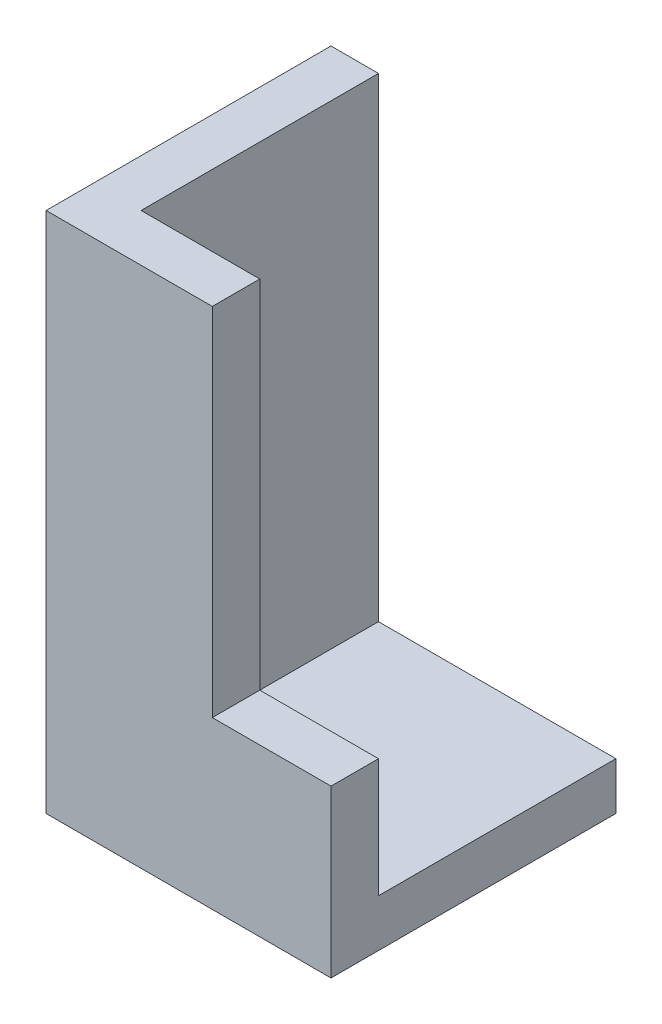
ISO-10303-21;
HEADER;
FILE_DESCRIPTION(('STEP AP214'),'2;1');
FILE_NAME('part.step','',(''),(''),'','','');
FILE_SCHEMA(('AUTOMOTIVE_DESIGN { 1 0 10303 214 1 1 1 1 }'));
ENDSEC;
DATA;
#1=APPLICATION_CONTEXT('core data for automotive mechanical design processes');
#2=APPLICATION_PROTOCOL_DEFINITION('international standard','automotive_design',2000,#1);
#3=PRODUCT_CONTEXT('',#1,'mechanical');
#4=PRODUCT('Part','Part','',(#3));
#5=PRODUCT_RELATED_PRODUCT_CATEGORY('part','',(#4));
#6=PRODUCT_DEFINITION_FORMATION('','',#4);
#7=PRODUCT_DEFINITION_CONTEXT('part definition',#1,'design');
#8=PRODUCT_DEFINITION('design','',#6,#7);
#9=PRODUCT_DEFINITION_SHAPE('','',#8);
#10=(LENGTH_UNIT() NAMED_UNIT(*) SI_UNIT(.MILLI.,.METRE.));
#11=(NAMED_UNIT(*) PLANE_ANGLE_UNIT() SI_UNIT($,.RADIAN.));
#12=(NAMED_UNIT(*) SI_UNIT($,.STERADIAN.) SOLID_ANGLE_UNIT());
#13=UNCERTAINTY_MEASURE_WITH_UNIT(LENGTH_MEASURE(1.E-05),#10,'distance_accuracy_value','');
#14=(GEOMETRIC_REPRESENTATION_CONTEXT(3) GLOBAL_UNCERTAINTY_ASSIGNED_CONTEXT((#13)) GLOBAL_UNIT_ASSIGNED_CONTEXT((#10,
#11,#12)) REPRESENTATION_CONTEXT('',''));
#15=CARTESIAN_POINT('',(0.,0.,0.));
#16=DIRECTION('',(0.,0.,1.));
#17=DIRECTION('',(1.,0.,0.));
#18=AXIS2_PLACEMENT_3D('',#15,#16,#17);
#19=CARTESIAN_POINT('',(0.,0.,50.));
#20=DIRECTION('',(1.,0.,0.));
#21=DIRECTION('',(0.,0.,-1.));
#22=AXIS2_PLACEMENT_3D('',#19,#20,#21);
#23=PLANE('',#22);
#24=DIRECTION('',(0.,-1.,0.));
#25=VECTOR('',#24,1.);
#26=CARTESIAN_POINT('',(0.,0.,0.));
#27=LINE('',#26,#25);
#28=CARTESIAN_POINT('',(0.,110.,0.));
#29=VERTEX_POINT('',#28);
#30=CARTESIAN_POINT('',(0.,0.,0.));
#31=VERTEX_POINT('',#30);
#32=EDGE_CURVE('E96',#29,#31,#27,.T.);
#33=ORIENTED_EDGE('',*,*,#32,.T.);
#34=DIRECTION('',(0.,0.,-1.));
#35=VECTOR('',#34,1.);
#36=CARTESIAN_POINT('',(0.,0.,50.));
#37=LINE('',#36,#35);
#38=CARTESIAN_POINT('',(0.,0.,60.));
#39=VERTEX_POINT('',#38);
#40=EDGE_CURVE('E11',#39,#31,#37,.T.);
#41=ORIENTED_EDGE('',*,*,#40,.F.);
#42=DIRECTION('',(0.,-1.,0.));
#43=VECTOR('',#42,1.);
#44=CARTESIAN_POINT('',(0.,0.,60.));
#45=LINE('',#44,#43);
#46=CARTESIAN_POINT('',(0.,110.,60.));
#47=VERTEX_POINT('',#46);
#48=EDGE_CURVE('E98',#47,#39,#45,.T.);
#49=ORIENTED_EDGE('',*,*,#48,.F.);
#50=DIRECTION('',(0.,0.,-1.));
#51=VECTOR('',#50,1.);
#52=CARTESIAN_POINT('',(0.,110.,50.));
#53=LINE('',#52,#51);
#54=EDGE_CURVE('E84',#47,#29,#53,.T.);
#55=ORIENTED_EDGE('',*,*,#54,.T.);
#56=EDGE_LOOP('',(#33,#41,#49,#55));
#57=FACE_BOUND('',#56,.T.);
#58=ADVANCED_FACE('F33',(#57),#23,.F.);
#59=CARTESIAN_POINT('',(0.,0.,50.));
#60=DIRECTION('',(0.,1.,0.));
#61=DIRECTION('',(0.,0.,1.));
#62=AXIS2_PLACEMENT_3D('',#59,#60,#61);
#63=PLANE('',#62);
#64=DIRECTION('',(1.,0.,0.));
#65=VECTOR('',#64,1.);
#66=CARTESIAN_POINT('',(0.,0.,0.));
#67=LINE('',#66,#65);
#68=CARTESIAN_POINT('',(60.,0.,0.));
#69=VERTEX_POINT('',#68);
#70=EDGE_CURVE('E103',#31,#69,#67,.T.);
#71=ORIENTED_EDGE('',*,*,#70,.T.);
#72=DIRECTION('',(0.,0.,-1.));
#73=VECTOR('',#72,1.);
#74=CARTESIAN_POINT('',(60.,0.,50.));
#75=LINE('',#74,#73);
#76=CARTESIAN_POINT('',(60.,0.,60.));
#77=VERTEX_POINT('',#76);
#78=EDGE_CURVE('E42',#77,#69,#75,.T.);
#79=ORIENTED_EDGE('',*,*,#78,.F.);
#80=DIRECTION('',(1.,0.,0.));
#81=VECTOR('',#80,1.);
#82=CARTESIAN_POINT('',(60.,0.,60.));
#83=LINE('',#82,#81);
#84=EDGE_CURVE('E154',#39,#77,#83,.T.);
#85=ORIENTED_EDGE('',*,*,#84,.F.);
#86=ORIENTED_EDGE('',*,*,#40,.T.);
#87=EDGE_LOOP('',(#71,#79,#85,#86));
#88=FACE_BOUND('',#87,.T.);
#89=ADVANCED_FACE('F152',(#88),#63,.F.);
#90=CARTESIAN_POINT('',(60.,10.,50.));
#91=DIRECTION('',(-1.,0.,0.));
#92=DIRECTION('',(0.,0.,1.));
#93=AXIS2_PLACEMENT_3D('',#90,#91,#92);
#94=PLANE('',#93);
#95=DIRECTION('',(0.,1.,0.));
#96=VECTOR('',#95,1.);
#97=CARTESIAN_POINT('',(60.,10.,0.));
#98=LINE('',#97,#96);
#99=CARTESIAN_POINT('',(60.,10.,0.));
#100=VERTEX_POINT('',#99);
#101=EDGE_CURVE('E106',#69,#100,#98,.T.);
#102=ORIENTED_EDGE('',*,*,#101,.T.);
#103=DIRECTION('',(0.,0.,-1.));
#104=VECTOR('',#103,1.);
#105=CARTESIAN_POINT('',(60.,10.,50.));
#106=LINE('',#105,#104);
#107=CARTESIAN_POINT('',(60.,10.,50.));
#108=VERTEX_POINT('',#107);
#109=EDGE_CURVE('E120',#108,#100,#106,.T.);
#110=ORIENTED_EDGE('',*,*,#109,.F.);
#111=DIRECTION('',(0.,1.,0.));
#112=VECTOR('',#111,1.);
#113=CARTESIAN_POINT('',(60.,35.,50.));
#114=LINE('',#113,#112);
#115=CARTESIAN_POINT('',(60.,35.,50.));
#116=VERTEX_POINT('',#115);
#117=EDGE_CURVE('E138',#108,#116,#114,.T.);
#118=ORIENTED_EDGE('',*,*,#117,.T.);
#119=DIRECTION('',(0.,0.,-1.));
#120=VECTOR('',#119,1.);
#121=CARTESIAN_POINT('',(60.,35.,60.));
#122=LINE('',#121,#120);
#123=CARTESIAN_POINT('',(60.,35.,60.));
#124=VERTEX_POINT('',#123);
#125=EDGE_CURVE('E104',#124,#116,#122,.T.);
#126=ORIENTED_EDGE('',*,*,#125,.F.);
#127=DIRECTION('',(0.,1.,0.));
#128=VECTOR('',#127,1.);
#129=CARTESIAN_POINT('',(60.,35.,60.));
#130=LINE('',#129,#128);
#131=EDGE_CURVE('E148',#77,#124,#130,.T.);
#132=ORIENTED_EDGE('',*,*,#131,.F.);
#133=ORIENTED_EDGE('',*,*,#78,.T.);
#134=EDGE_LOOP('',(#102,#110,#118,#126,#132,#133));
#135=FACE_BOUND('',#134,.T.);
#136=ADVANCED_FACE('F142',(#135),#94,.F.);
#137=CARTESIAN_POINT('',(10.,10.,50.));
#138=DIRECTION('',(0.,-1.,0.));
#139=DIRECTION('',(0.,0.,-1.));
#140=AXIS2_PLACEMENT_3D('',#137,#138,#139);
#141=PLANE('',#140);
#142=DIRECTION('',(-1.,0.,0.));
#143=VECTOR('',#142,1.);
#144=CARTESIAN_POINT('',(10.,10.,0.));
#145=LINE('',#144,#143);
#146=CARTESIAN_POINT('',(10.,10.,0.));
#147=VERTEX_POINT('',#146);
#148=EDGE_CURVE('E116',#100,#147,#145,.T.);
#149=ORIENTED_EDGE('',*,*,#148,.T.);
#150=DIRECTION('',(0.,0.,-1.));
#151=VECTOR('',#150,1.);
#152=CARTESIAN_POINT('',(10.,10.,50.));
#153=LINE('',#152,#151);
#154=CARTESIAN_POINT('',(10.,10.,50.));
#155=VERTEX_POINT('',#154);
#156=EDGE_CURVE('E51',#155,#147,#153,.T.);
#157=ORIENTED_EDGE('',*,*,#156,.F.);
#158=DIRECTION('',(-1.,0.,0.));
#159=VECTOR('',#158,1.);
#160=CARTESIAN_POINT('',(10.,10.,50.));
#161=LINE('',#160,#159);
#162=EDGE_CURVE('E90',#108,#155,#161,.T.);
#163=ORIENTED_EDGE('',*,*,#162,.F.);
#164=ORIENTED_EDGE('',*,*,#109,.T.);
#165=EDGE_LOOP('',(#149,#157,#163,#164));
#166=FACE_BOUND('',#165,.T.);
#167=ADVANCED_FACE('F139',(#166),#141,.F.);
#168=CARTESIAN_POINT('',(10.,110.,50.));
#169=DIRECTION('',(-1.,0.,0.));
#170=DIRECTION('',(0.,0.,1.));
#171=AXIS2_PLACEMENT_3D('',#168,#169,#170);
#172=PLANE('',#171);
#173=DIRECTION('',(0.,1.,0.));
#174=VECTOR('',#173,1.);
#175=CARTESIAN_POINT('',(10.,110.,0.));
#176=LINE('',#175,#174);
#177=CARTESIAN_POINT('',(10.,110.,0.));
#178=VERTEX_POINT('',#177);
#179=EDGE_CURVE('E73',#147,#178,#176,.T.);
#180=ORIENTED_EDGE('',*,*,#179,.T.);
#181=DIRECTION('',(0.,0.,-1.));
#182=VECTOR('',#181,1.);
#183=CARTESIAN_POINT('',(10.,110.,50.));
#184=LINE('',#183,#182);
#185=CARTESIAN_POINT('',(10.,110.,50.));
#186=VERTEX_POINT('',#185);
#187=EDGE_CURVE('E87',#186,#178,#184,.T.);
#188=ORIENTED_EDGE('',*,*,#187,.F.);
#189=DIRECTION('',(0.,1.,0.));
#190=VECTOR('',#189,1.);
#191=CARTESIAN_POINT('',(10.,110.,50.));
#192=LINE('',#191,#190);
#193=EDGE_CURVE('E99',#155,#186,#192,.T.);
#194=ORIENTED_EDGE('',*,*,#193,.F.);
#195=ORIENTED_EDGE('',*,*,#156,.T.);
#196=EDGE_LOOP('',(#180,#188,#194,#195));
#197=FACE_BOUND('',#196,.T.);
#198=ADVANCED_FACE('F209',(#197),#172,.F.);
#199=CARTESIAN_POINT('',(0.,110.,50.));
#200=DIRECTION('',(0.,-1.,0.));
#201=DIRECTION('',(1.,0.,0.));
#202=AXIS2_PLACEMENT_3D('',#199,#200,#201);
#203=PLANE('',#202);
#204=DIRECTION('',(-1.,0.,0.));
#205=VECTOR('',#204,1.);
#206=CARTESIAN_POINT('',(0.,110.,0.));
#207=LINE('',#206,#205);
#208=EDGE_CURVE('E79',#178,#29,#207,.T.);
#209=ORIENTED_EDGE('',*,*,#208,.T.);
#210=ORIENTED_EDGE('',*,*,#54,.F.);
#211=DIRECTION('',(-1.,0.,0.));
#212=VECTOR('',#211,1.);
#213=CARTESIAN_POINT('',(0.,110.,60.));
#214=LINE('',#213,#212);
#215=CARTESIAN_POINT('',(35.,110.,60.));
#216=VERTEX_POINT('',#215);
#217=EDGE_CURVE('E170',#216,#47,#214,.T.);
#218=ORIENTED_EDGE('',*,*,#217,.F.);
#219=DIRECTION('',(0.,0.,-1.));
#220=VECTOR('',#219,1.);
#221=CARTESIAN_POINT('',(35.,110.,60.));
#222=LINE('',#221,#220);
#223=CARTESIAN_POINT('',(35.,110.,50.));
#224=VERTEX_POINT('',#223);
#225=EDGE_CURVE('E172',#216,#224,#222,.T.);
#226=ORIENTED_EDGE('',*,*,#225,.T.);
#227=DIRECTION('',(-1.,0.,0.));
#228=VECTOR('',#227,1.);
#229=CARTESIAN_POINT('',(0.,110.,50.));
#230=LINE('',#229,#228);
#231=EDGE_CURVE('E163',#224,#186,#230,.T.);
#232=ORIENTED_EDGE('',*,*,#231,.T.);
#233=ORIENTED_EDGE('',*,*,#187,.T.);
#234=EDGE_LOOP('',(#209,#210,#218,#226,#232,#233));
#235=FACE_BOUND('',#234,.T.);
#236=ADVANCED_FACE('F81',(#235),#203,.F.);
#237=CARTESIAN_POINT('',(0.,0.,0.));
#238=DIRECTION('',(0.,0.,-1.));
#239=DIRECTION('',(-1.,0.,0.));
#240=AXIS2_PLACEMENT_3D('',#237,#238,#239);
#241=PLANE('',#240);
#242=ORIENTED_EDGE('',*,*,#32,.F.);
#243=ORIENTED_EDGE('',*,*,#208,.F.);
#244=ORIENTED_EDGE('',*,*,#179,.F.);
#245=ORIENTED_EDGE('',*,*,#148,.F.);
#246=ORIENTED_EDGE('',*,*,#101,.F.);
#247=ORIENTED_EDGE('',*,*,#70,.F.);
#248=EDGE_LOOP('',(#242,#243,#244,#245,#246,#247));
#249=FACE_BOUND('',#248,.T.);
#250=ADVANCED_FACE('F101',(#249),#241,.T.);
#251=CARTESIAN_POINT('',(35.,35.,60.));
#252=DIRECTION('',(0.,-1.,0.));
#253=DIRECTION('',(0.,0.,-1.));
#254=AXIS2_PLACEMENT_3D('',#251,#252,#253);
#255=PLANE('',#254);
#256=DIRECTION('',(-1.,0.,0.));
#257=VECTOR('',#256,1.);
#258=CARTESIAN_POINT('',(35.,35.,50.));
#259=LINE('',#258,#257);
#260=CARTESIAN_POINT('',(35.,35.,50.));
#261=VERTEX_POINT('',#260);
#262=EDGE_CURVE('E175',#116,#261,#259,.T.);
#263=ORIENTED_EDGE('',*,*,#262,.T.);
#264=DIRECTION('',(0.,0.,-1.));
#265=VECTOR('',#264,1.);
#266=CARTESIAN_POINT('',(35.,35.,60.));
#267=LINE('',#266,#265);
#268=CARTESIAN_POINT('',(35.,35.,60.));
#269=VERTEX_POINT('',#268);
#270=EDGE_CURVE('E109',#269,#261,#267,.T.);
#271=ORIENTED_EDGE('',*,*,#270,.F.);
#272=DIRECTION('',(-1.,0.,0.));
#273=VECTOR('',#272,1.);
#274=CARTESIAN_POINT('',(35.,35.,60.));
#275=LINE('',#274,#273);
#276=EDGE_CURVE('E161',#124,#269,#275,.T.);
#277=ORIENTED_EDGE('',*,*,#276,.F.);
#278=ORIENTED_EDGE('',*,*,#125,.T.);
#279=EDGE_LOOP('',(#263,#271,#277,#278));
#280=FACE_BOUND('',#279,.T.);
#281=ADVANCED_FACE('F200',(#280),#255,.F.);
#282=CARTESIAN_POINT('',(35.,110.,60.));
#283=DIRECTION('',(-1.,0.,0.));
#284=DIRECTION('',(0.,-1.,0.));
#285=AXIS2_PLACEMENT_3D('',#282,#283,#284);
#286=PLANE('',#285);
#287=DIRECTION('',(0.,1.,0.));
#288=VECTOR('',#287,1.);
#289=CARTESIAN_POINT('',(35.,110.,50.));
#290=LINE('',#289,#288);
#291=EDGE_CURVE('E179',#261,#224,#290,.T.);
#292=ORIENTED_EDGE('',*,*,#291,.T.);
#293=ORIENTED_EDGE('',*,*,#225,.F.);
#294=DIRECTION('',(0.,1.,0.));
#295=VECTOR('',#294,1.);
#296=CARTESIAN_POINT('',(35.,110.,60.));
#297=LINE('',#296,#295);
#298=EDGE_CURVE('E167',#269,#216,#297,.T.);
#299=ORIENTED_EDGE('',*,*,#298,.F.);
#300=ORIENTED_EDGE('',*,*,#270,.T.);
#301=EDGE_LOOP('',(#292,#293,#299,#300));
#302=FACE_BOUND('',#301,.T.);
#303=ADVANCED_FACE('F191',(#302),#286,.F.);
#304=CARTESIAN_POINT('',(0.,0.,60.));
#305=DIRECTION('',(0.,0.,-1.));
#306=DIRECTION('',(-1.,0.,0.));
#307=AXIS2_PLACEMENT_3D('',#304,#305,#306);
#308=PLANE('',#307);
#309=ORIENTED_EDGE('',*,*,#48,.T.);
#310=ORIENTED_EDGE('',*,*,#84,.T.);
#311=ORIENTED_EDGE('',*,*,#131,.T.);
#312=ORIENTED_EDGE('',*,*,#276,.T.);
#313=ORIENTED_EDGE('',*,*,#298,.T.);
#314=ORIENTED_EDGE('',*,*,#217,.T.);
#315=EDGE_LOOP('',(#309,#310,#311,#312,#313,#314));
#316=FACE_BOUND('',#315,.T.);
#317=ADVANCED_FACE('F158',(#316),#308,.F.);
#318=CARTESIAN_POINT('',(0.,0.,50.));
#319=DIRECTION('',(0.,0.,-1.));
#320=DIRECTION('',(-1.,0.,0.));
#321=AXIS2_PLACEMENT_3D('',#318,#319,#320);
#322=PLANE('',#321);
#323=ORIENTED_EDGE('',*,*,#117,.F.);
#324=ORIENTED_EDGE('',*,*,#162,.T.);
#325=ORIENTED_EDGE('',*,*,#193,.T.);
#326=ORIENTED_EDGE('',*,*,#231,.F.);
#327=ORIENTED_EDGE('',*,*,#291,.F.);
#328=ORIENTED_EDGE('',*,*,#262,.F.);
#329=EDGE_LOOP('',(#323,#324,#325,#326,#327,#328));
#330=FACE_BOUND('',#329,.T.);
#331=ADVANCED_FACE('F134',(#330),#322,.T.);
#332=CLOSED_SHELL('',(#58,#89,#136,#167,#198,#236,#250,#281,#303,#317,#331));
#333=MANIFOLD_SOLID_BREP('B2',#332);
#334=ADVANCED_BREP_SHAPE_REPRESENTATION('',(#18,#333),#14);
#335=SHAPE_DEFINITION_REPRESENTATION(#9,#334);
ENDSEC;
END-ISO-10303-21;
